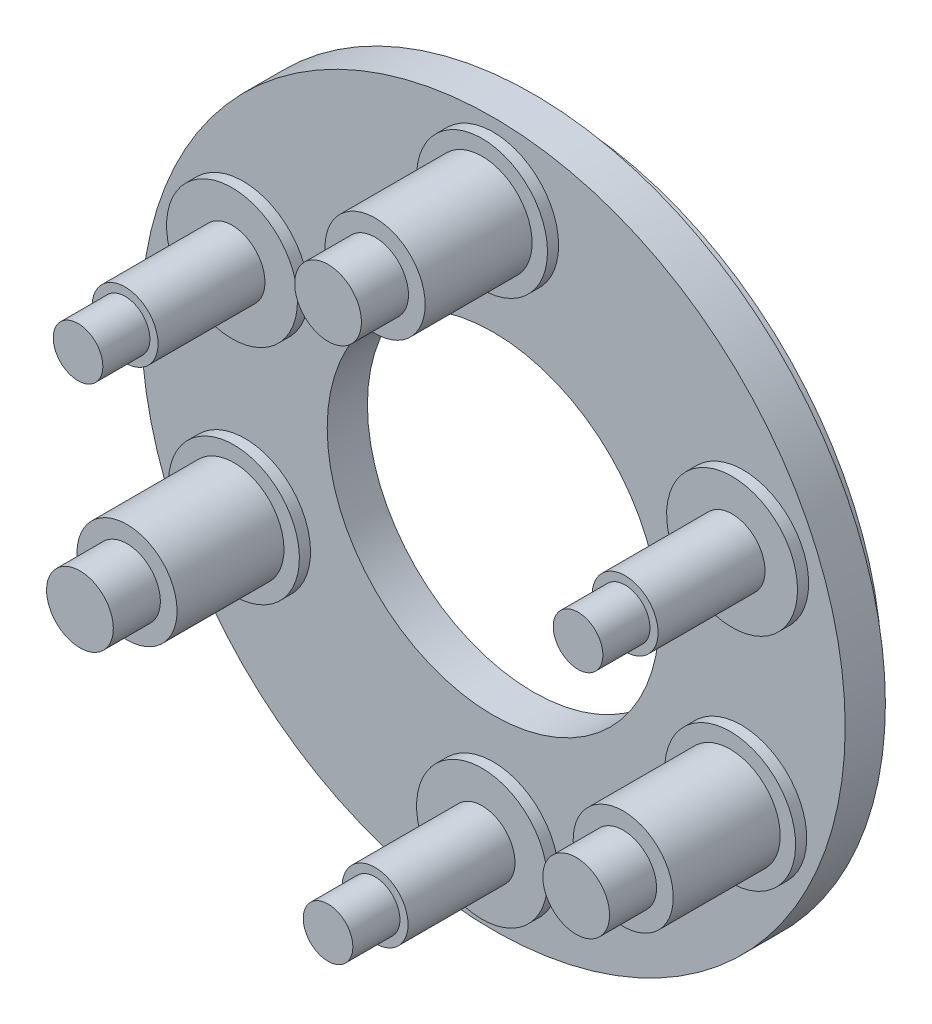
ISO-10303-21;
HEADER;
FILE_DESCRIPTION(('STEP AP214'),'2;1');
FILE_NAME('part.step','',(''),(''),'','','');
FILE_SCHEMA(('AUTOMOTIVE_DESIGN { 1 0 10303 214 1 1 1 1 }'));
ENDSEC;
DATA;
#1=APPLICATION_CONTEXT('core data for automotive mechanical design processes');
#2=APPLICATION_PROTOCOL_DEFINITION('international standard','automotive_design',2000,#1);
#3=PRODUCT_CONTEXT('',#1,'mechanical');
#4=PRODUCT('Part','Part','',(#3));
#5=PRODUCT_RELATED_PRODUCT_CATEGORY('part','',(#4));
#6=PRODUCT_DEFINITION_FORMATION('','',#4);
#7=PRODUCT_DEFINITION_CONTEXT('part definition',#1,'design');
#8=PRODUCT_DEFINITION('design','',#6,#7);
#9=PRODUCT_DEFINITION_SHAPE('','',#8);
#10=(LENGTH_UNIT() NAMED_UNIT(*) SI_UNIT(.MILLI.,.METRE.));
#11=(NAMED_UNIT(*) PLANE_ANGLE_UNIT() SI_UNIT($,.RADIAN.));
#12=(NAMED_UNIT(*) SI_UNIT($,.STERADIAN.) SOLID_ANGLE_UNIT());
#13=UNCERTAINTY_MEASURE_WITH_UNIT(LENGTH_MEASURE(1.E-05),#10,'distance_accuracy_value','');
#14=(GEOMETRIC_REPRESENTATION_CONTEXT(3) GLOBAL_UNCERTAINTY_ASSIGNED_CONTEXT((#13)) GLOBAL_UNIT_ASSIGNED_CONTEXT((#10,
#11,#12)) REPRESENTATION_CONTEXT('',''));
#15=CARTESIAN_POINT('',(0.,0.,0.));
#16=DIRECTION('',(0.,0.,1.));
#17=DIRECTION('',(1.,0.,0.));
#18=AXIS2_PLACEMENT_3D('',#15,#16,#17);
#19=CARTESIAN_POINT('',(0.,0.,0.));
#20=DIRECTION('',(0.,0.,1.));
#21=DIRECTION('',(1.,0.,0.));
#22=AXIS2_PLACEMENT_3D('',#19,#20,#21);
#23=PLANE('',#22);
#24=CARTESIAN_POINT('',(0.,0.,0.));
#25=DIRECTION('',(0.,0.,1.));
#26=DIRECTION('',(1.,0.,0.));
#27=AXIS2_PLACEMENT_3D('',#24,#25,#26);
#28=CIRCLE('',#27,4.9276);
#29=CARTESIAN_POINT('',(4.9276,0.,0.));
#30=VERTEX_POINT('',#29);
#31=EDGE_CURVE('E48',#30,#30,#28,.T.);
#32=ORIENTED_EDGE('',*,*,#31,.T.);
#33=EDGE_LOOP('',(#32));
#34=FACE_BOUND('',#33,.T.);
#35=CARTESIAN_POINT('',(0.,0.,0.));
#36=DIRECTION('',(0.,0.,-1.));
#37=DIRECTION('',(-1.,0.,0.));
#38=AXIS2_PLACEMENT_3D('',#35,#36,#37);
#39=CIRCLE('',#38,8.89);
#40=CARTESIAN_POINT('',(-8.89,0.,0.));
#41=VERTEX_POINT('',#40);
#42=EDGE_CURVE('E57',#41,#41,#39,.T.);
#43=ORIENTED_EDGE('',*,*,#42,.T.);
#44=EDGE_LOOP('',(#43));
#45=FACE_BOUND('',#44,.T.);
#46=ADVANCED_FACE('F30',(#34,#45),#23,.F.);
#47=CARTESIAN_POINT('',(0.,0.,1.1938));
#48=DIRECTION('',(0.,0.,1.));
#49=DIRECTION('',(1.,0.,0.));
#50=AXIS2_PLACEMENT_3D('',#47,#48,#49);
#51=PLANE('',#50);
#52=CARTESIAN_POINT('',(-7.42341139066719,3.15105118570178,1.1938));
#53=DIRECTION('',(0.,0.,1.));
#54=DIRECTION('',(-0.390731128489278,-0.920504853452439,0.));
#55=AXIS2_PLACEMENT_3D('',#52,#53,#54);
#56=CIRCLE('',#55,1.9431);
#57=CARTESIAN_POINT('',(-8.18264104643471,1.36241820495835,1.1938));
#58=VERTEX_POINT('',#57);
#59=EDGE_CURVE('E153',#58,#58,#56,.T.);
#60=ORIENTED_EDGE('',*,*,#59,.F.);
#61=EDGE_LOOP('',(#60));
#62=FACE_BOUND('',#61,.T.);
#63=CARTESIAN_POINT('',(7.42341139066719,3.15105118570178,1.1938));
#64=DIRECTION('',(0.,0.,1.));
#65=DIRECTION('',(-0.390731128489278,0.920504853452439,0.));
#66=AXIS2_PLACEMENT_3D('',#63,#64,#65);
#67=CIRCLE('',#66,1.9431);
#68=CARTESIAN_POINT('',(6.66418173489968,4.93968416644521,1.1938));
#69=VERTEX_POINT('',#68);
#70=EDGE_CURVE('E135',#69,#69,#67,.T.);
#71=ORIENTED_EDGE('',*,*,#70,.F.);
#72=EDGE_LOOP('',(#71));
#73=FACE_BOUND('',#72,.T.);
#74=CARTESIAN_POINT('',(0.,-8.0645,1.1938));
#75=DIRECTION('',(0.,0.,1.));
#76=DIRECTION('',(1.,0.,0.));
#77=AXIS2_PLACEMENT_3D('',#74,#75,#76);
#78=CIRCLE('',#77,1.9431);
#79=CARTESIAN_POINT('',(1.9431,-8.0645,1.1938));
#80=VERTEX_POINT('',#79);
#81=EDGE_CURVE('E117',#80,#80,#78,.T.);
#82=ORIENTED_EDGE('',*,*,#81,.F.);
#83=EDGE_LOOP('',(#82));
#84=FACE_BOUND('',#83,.T.);
#85=CARTESIAN_POINT('',(7.36646969303388,-3.43504123142844,1.1938));
#86=DIRECTION('',(0.,0.,1.));
#87=DIRECTION('',(-0.422618261740703,-0.906307787036648,0.));
#88=AXIS2_PLACEMENT_3D('',#85,#86,#87);
#89=CIRCLE('',#88,1.9431);
#90=CARTESIAN_POINT('',(6.54528014864552,-5.19608789241935,1.1938));
#91=VERTEX_POINT('',#90);
#92=EDGE_CURVE('E99',#91,#91,#89,.T.);
#93=ORIENTED_EDGE('',*,*,#92,.F.);
#94=EDGE_LOOP('',(#93));
#95=FACE_BOUND('',#94,.T.);
#96=CARTESIAN_POINT('',(-7.36646969303388,-3.43504123142844,1.1938));
#97=DIRECTION('',(0.,0.,1.));
#98=DIRECTION('',(-0.422618261740703,0.906307787036648,0.));
#99=AXIS2_PLACEMENT_3D('',#96,#97,#98);
#100=CIRCLE('',#99,1.9431);
#101=CARTESIAN_POINT('',(-8.18765923742224,-1.67399457043753,1.1938));
#102=VERTEX_POINT('',#101);
#103=EDGE_CURVE('E81',#102,#102,#100,.T.);
#104=ORIENTED_EDGE('',*,*,#103,.F.);
#105=EDGE_LOOP('',(#104));
#106=FACE_BOUND('',#105,.T.);
#107=CARTESIAN_POINT('',(0.,8.128,1.1938));
#108=DIRECTION('',(0.,0.,1.));
#109=DIRECTION('',(1.,0.,0.));
#110=AXIS2_PLACEMENT_3D('',#107,#108,#109);
#111=CIRCLE('',#110,1.9431);
#112=CARTESIAN_POINT('',(1.9431,8.128,1.1938));
#113=VERTEX_POINT('',#112);
#114=EDGE_CURVE('E63',#113,#113,#111,.T.);
#115=ORIENTED_EDGE('',*,*,#114,.F.);
#116=EDGE_LOOP('',(#115));
#117=FACE_BOUND('',#116,.T.);
#118=CARTESIAN_POINT('',(0.,0.,1.1938));
#119=DIRECTION('',(0.,0.,1.));
#120=DIRECTION('',(1.,0.,0.));
#121=AXIS2_PLACEMENT_3D('',#118,#119,#120);
#122=CIRCLE('',#121,10.4521);
#123=CARTESIAN_POINT('',(10.4521,0.,1.1938));
#124=VERTEX_POINT('',#123);
#125=EDGE_CURVE('E37',#124,#124,#122,.T.);
#126=ORIENTED_EDGE('',*,*,#125,.T.);
#127=EDGE_LOOP('',(#126));
#128=FACE_BOUND('',#127,.T.);
#129=CARTESIAN_POINT('',(0.,0.,1.1938));
#130=DIRECTION('',(0.,0.,1.));
#131=DIRECTION('',(1.,0.,0.));
#132=AXIS2_PLACEMENT_3D('',#129,#130,#131);
#133=CIRCLE('',#132,4.9276);
#134=CARTESIAN_POINT('',(4.9276,0.,1.1938));
#135=VERTEX_POINT('',#134);
#136=EDGE_CURVE('E46',#135,#135,#133,.T.);
#137=ORIENTED_EDGE('',*,*,#136,.F.);
#138=EDGE_LOOP('',(#137));
#139=FACE_BOUND('',#138,.T.);
#140=ADVANCED_FACE('F204',(#62,#73,#84,#95,#106,#117,#128,#139),#51,.T.);
#141=CARTESIAN_POINT('',(0.,0.,0.));
#142=DIRECTION('',(0.,0.,1.));
#143=DIRECTION('',(1.,0.,0.));
#144=AXIS2_PLACEMENT_3D('',#141,#142,#143);
#145=CIRCLE('',#144,9.6393);
#146=CARTESIAN_POINT('',(9.6393,0.,0.));
#147=VERTEX_POINT('',#146);
#148=EDGE_CURVE('E10',#147,#147,#145,.F.);
#149=ORIENTED_EDGE('',*,*,#148,.F.);
#150=EDGE_LOOP('',(#149));
#151=FACE_BOUND('',#150,.T.);
#152=CARTESIAN_POINT('',(0.,0.,0.));
#153=DIRECTION('',(0.,0.,1.));
#154=DIRECTION('',(1.,0.,0.));
#155=AXIS2_PLACEMENT_3D('',#152,#153,#154);
#156=CIRCLE('',#155,10.4521);
#157=CARTESIAN_POINT('',(10.4521,0.,0.));
#158=VERTEX_POINT('',#157);
#159=EDGE_CURVE('E41',#158,#158,#156,.T.);
#160=ORIENTED_EDGE('',*,*,#159,.F.);
#161=EDGE_LOOP('',(#160));
#162=FACE_BOUND('',#161,.T.);
#163=ADVANCED_FACE('F207',(#151,#162),#23,.F.);
#164=CARTESIAN_POINT('',(0.,0.,1.1938));
#165=DIRECTION('',(0.,0.,-1.));
#166=DIRECTION('',(-1.,0.,0.));
#167=AXIS2_PLACEMENT_3D('',#164,#165,#166);
#168=CYLINDRICAL_SURFACE('',#167,10.4521);
#169=ORIENTED_EDGE('',*,*,#125,.F.);
#170=EDGE_LOOP('',(#169));
#171=FACE_BOUND('',#170,.T.);
#172=ORIENTED_EDGE('',*,*,#159,.T.);
#173=EDGE_LOOP('',(#172));
#174=FACE_BOUND('',#173,.T.);
#175=ADVANCED_FACE('F32',(#171,#174),#168,.T.);
#176=CARTESIAN_POINT('',(0.,0.,1.1938));
#177=DIRECTION('',(0.,0.,-1.));
#178=DIRECTION('',(-1.,0.,0.));
#179=AXIS2_PLACEMENT_3D('',#176,#177,#178);
#180=CYLINDRICAL_SURFACE('',#179,4.9276);
#181=ORIENTED_EDGE('',*,*,#136,.T.);
#182=EDGE_LOOP('',(#181));
#183=FACE_BOUND('',#182,.T.);
#184=ORIENTED_EDGE('',*,*,#31,.F.);
#185=EDGE_LOOP('',(#184));
#186=FACE_BOUND('',#185,.T.);
#187=ADVANCED_FACE('F221',(#183,#186),#180,.F.);
#188=CARTESIAN_POINT('',(0.,0.,-0.7112));
#189=DIRECTION('',(0.,0.,-1.));
#190=DIRECTION('',(-1.,0.,0.));
#191=AXIS2_PLACEMENT_3D('',#188,#189,#190);
#192=PLANE('',#191);
#193=CARTESIAN_POINT('',(0.,0.,-0.7112));
#194=DIRECTION('',(0.,0.,-1.));
#195=DIRECTION('',(-1.,0.,0.));
#196=AXIS2_PLACEMENT_3D('',#193,#194,#195);
#197=CIRCLE('',#196,9.6393);
#198=CARTESIAN_POINT('',(-9.6393,0.,-0.7112));
#199=VERTEX_POINT('',#198);
#200=EDGE_CURVE('E51',#199,#199,#197,.T.);
#201=ORIENTED_EDGE('',*,*,#200,.T.);
#202=EDGE_LOOP('',(#201));
#203=FACE_BOUND('',#202,.T.);
#204=CARTESIAN_POINT('',(0.,0.,-0.7112));
#205=DIRECTION('',(0.,0.,-1.));
#206=DIRECTION('',(-1.,0.,0.));
#207=AXIS2_PLACEMENT_3D('',#204,#205,#206);
#208=CIRCLE('',#207,8.89);
#209=CARTESIAN_POINT('',(-8.89,0.,-0.7112));
#210=VERTEX_POINT('',#209);
#211=EDGE_CURVE('E56',#210,#210,#208,.T.);
#212=ORIENTED_EDGE('',*,*,#211,.F.);
#213=EDGE_LOOP('',(#212));
#214=FACE_BOUND('',#213,.T.);
#215=ADVANCED_FACE('F224',(#203,#214),#192,.T.);
#216=CARTESIAN_POINT('',(0.,0.,-0.7112));
#217=DIRECTION('',(0.,0.,1.));
#218=DIRECTION('',(1.,0.,0.));
#219=AXIS2_PLACEMENT_3D('',#216,#217,#218);
#220=CYLINDRICAL_SURFACE('',#219,9.6393);
#221=ORIENTED_EDGE('',*,*,#200,.F.);
#222=EDGE_LOOP('',(#221));
#223=FACE_BOUND('',#222,.T.);
#224=ORIENTED_EDGE('',*,*,#148,.T.);
#225=EDGE_LOOP('',(#224));
#226=FACE_BOUND('',#225,.T.);
#227=ADVANCED_FACE('F235',(#223,#226),#220,.T.);
#228=CARTESIAN_POINT('',(0.,0.,-0.7112));
#229=DIRECTION('',(0.,0.,1.));
#230=DIRECTION('',(1.,0.,0.));
#231=AXIS2_PLACEMENT_3D('',#228,#229,#230);
#232=CYLINDRICAL_SURFACE('',#231,8.89);
#233=ORIENTED_EDGE('',*,*,#211,.T.);
#234=EDGE_LOOP('',(#233));
#235=FACE_BOUND('',#234,.T.);
#236=ORIENTED_EDGE('',*,*,#42,.F.);
#237=EDGE_LOOP('',(#236));
#238=FACE_BOUND('',#237,.T.);
#239=ADVANCED_FACE('F232',(#235,#238),#232,.F.);
#240=CARTESIAN_POINT('',(0.,8.128,1.524));
#241=DIRECTION('',(0.,0.,-1.));
#242=DIRECTION('',(-1.,0.,0.));
#243=AXIS2_PLACEMENT_3D('',#240,#241,#242);
#244=CYLINDRICAL_SURFACE('',#243,1.9431);
#245=CARTESIAN_POINT('',(0.,8.128,1.524));
#246=DIRECTION('',(0.,0.,1.));
#247=DIRECTION('',(1.,0.,0.));
#248=AXIS2_PLACEMENT_3D('',#245,#246,#247);
#249=CIRCLE('',#248,1.9431);
#250=CARTESIAN_POINT('',(1.9431,8.128,1.524));
#251=VERTEX_POINT('',#250);
#252=EDGE_CURVE('E60',#251,#251,#249,.T.);
#253=ORIENTED_EDGE('',*,*,#252,.F.);
#254=EDGE_LOOP('',(#253));
#255=FACE_BOUND('',#254,.T.);
#256=ORIENTED_EDGE('',*,*,#114,.T.);
#257=EDGE_LOOP('',(#256));
#258=FACE_BOUND('',#257,.T.);
#259=ADVANCED_FACE('F234',(#255,#258),#244,.T.);
#260=CARTESIAN_POINT('',(0.,8.128,1.524));
#261=DIRECTION('',(0.,0.,1.));
#262=DIRECTION('',(1.,0.,0.));
#263=AXIS2_PLACEMENT_3D('',#260,#261,#262);
#264=PLANE('',#263);
#265=CARTESIAN_POINT('',(0.,8.128,1.524));
#266=DIRECTION('',(0.,0.,1.));
#267=DIRECTION('',(1.,0.,0.));
#268=AXIS2_PLACEMENT_3D('',#265,#266,#267);
#269=CIRCLE('',#268,1.4859);
#270=CARTESIAN_POINT('',(1.4859,8.128,1.524));
#271=VERTEX_POINT('',#270);
#272=EDGE_CURVE('E69',#271,#271,#269,.T.);
#273=ORIENTED_EDGE('',*,*,#272,.F.);
#274=EDGE_LOOP('',(#273));
#275=FACE_BOUND('',#274,.T.);
#276=ORIENTED_EDGE('',*,*,#252,.T.);
#277=EDGE_LOOP('',(#276));
#278=FACE_BOUND('',#277,.T.);
#279=ADVANCED_FACE('F242',(#275,#278),#264,.T.);
#280=CARTESIAN_POINT('',(0.,8.128,4.699));
#281=DIRECTION('',(0.,0.,-1.));
#282=DIRECTION('',(-1.,0.,0.));
#283=AXIS2_PLACEMENT_3D('',#280,#281,#282);
#284=CYLINDRICAL_SURFACE('',#283,1.4859);
#285=CARTESIAN_POINT('',(0.,8.128,4.699));
#286=DIRECTION('',(0.,0.,1.));
#287=DIRECTION('',(1.,0.,0.));
#288=AXIS2_PLACEMENT_3D('',#285,#286,#287);
#289=CIRCLE('',#288,1.4859);
#290=CARTESIAN_POINT('',(1.4859,8.128,4.699));
#291=VERTEX_POINT('',#290);
#292=EDGE_CURVE('E66',#291,#291,#289,.T.);
#293=ORIENTED_EDGE('',*,*,#292,.F.);
#294=EDGE_LOOP('',(#293));
#295=FACE_BOUND('',#294,.T.);
#296=ORIENTED_EDGE('',*,*,#272,.T.);
#297=EDGE_LOOP('',(#296));
#298=FACE_BOUND('',#297,.T.);
#299=ADVANCED_FACE('F294',(#295,#298),#284,.T.);
#300=CARTESIAN_POINT('',(0.,8.128,4.699));
#301=DIRECTION('',(0.,0.,1.));
#302=DIRECTION('',(1.,0.,0.));
#303=AXIS2_PLACEMENT_3D('',#300,#301,#302);
#304=PLANE('',#303);
#305=CARTESIAN_POINT('',(0.,8.128,4.699));
#306=DIRECTION('',(0.,0.,1.));
#307=DIRECTION('',(1.,0.,0.));
#308=AXIS2_PLACEMENT_3D('',#305,#306,#307);
#309=CIRCLE('',#308,0.9906);
#310=CARTESIAN_POINT('',(0.9906,8.128,4.699));
#311=VERTEX_POINT('',#310);
#312=EDGE_CURVE('E75',#311,#311,#309,.T.);
#313=ORIENTED_EDGE('',*,*,#312,.F.);
#314=EDGE_LOOP('',(#313));
#315=FACE_BOUND('',#314,.T.);
#316=ORIENTED_EDGE('',*,*,#292,.T.);
#317=EDGE_LOOP('',(#316));
#318=FACE_BOUND('',#317,.T.);
#319=ADVANCED_FACE('F303',(#315,#318),#304,.T.);
#320=CARTESIAN_POINT('',(0.,8.128,6.096));
#321=DIRECTION('',(0.,0.,-1.));
#322=DIRECTION('',(-1.,0.,0.));
#323=AXIS2_PLACEMENT_3D('',#320,#321,#322);
#324=CYLINDRICAL_SURFACE('',#323,0.9906);
#325=CARTESIAN_POINT('',(0.,8.128,6.096));
#326=DIRECTION('',(0.,0.,1.));
#327=DIRECTION('',(1.,0.,0.));
#328=AXIS2_PLACEMENT_3D('',#325,#326,#327);
#329=CIRCLE('',#328,0.9906);
#330=CARTESIAN_POINT('',(0.9906,8.128,6.096));
#331=VERTEX_POINT('',#330);
#332=EDGE_CURVE('E72',#331,#331,#329,.T.);
#333=ORIENTED_EDGE('',*,*,#332,.F.);
#334=EDGE_LOOP('',(#333));
#335=FACE_BOUND('',#334,.T.);
#336=ORIENTED_EDGE('',*,*,#312,.T.);
#337=EDGE_LOOP('',(#336));
#338=FACE_BOUND('',#337,.T.);
#339=ADVANCED_FACE('F313',(#335,#338),#324,.T.);
#340=CARTESIAN_POINT('',(0.,8.128,6.096));
#341=DIRECTION('',(0.,0.,1.));
#342=DIRECTION('',(1.,0.,0.));
#343=AXIS2_PLACEMENT_3D('',#340,#341,#342);
#344=PLANE('',#343);
#345=ORIENTED_EDGE('',*,*,#332,.T.);
#346=EDGE_LOOP('',(#345));
#347=FACE_BOUND('',#346,.T.);
#348=ADVANCED_FACE('F323',(#347),#344,.T.);
#349=CARTESIAN_POINT('',(-7.36646969303388,-3.43504123142844,1.524));
#350=DIRECTION('',(0.,0.,-1.));
#351=DIRECTION('',(-1.,0.,0.));
#352=AXIS2_PLACEMENT_3D('',#349,#350,#351);
#353=CYLINDRICAL_SURFACE('',#352,1.9431);
#354=CARTESIAN_POINT('',(-7.36646969303388,-3.43504123142844,1.524));
#355=DIRECTION('',(0.,0.,1.));
#356=DIRECTION('',(-0.422618261740703,0.906307787036648,0.));
#357=AXIS2_PLACEMENT_3D('',#354,#355,#356);
#358=CIRCLE('',#357,1.9431);
#359=CARTESIAN_POINT('',(-8.18765923742224,-1.67399457043753,1.524));
#360=VERTEX_POINT('',#359);
#361=EDGE_CURVE('E78',#360,#360,#358,.T.);
#362=ORIENTED_EDGE('',*,*,#361,.F.);
#363=EDGE_LOOP('',(#362));
#364=FACE_BOUND('',#363,.T.);
#365=ORIENTED_EDGE('',*,*,#103,.T.);
#366=EDGE_LOOP('',(#365));
#367=FACE_BOUND('',#366,.T.);
#368=ADVANCED_FACE('F333',(#364,#367),#353,.T.);
#369=CARTESIAN_POINT('',(-7.36646969303388,-3.43504123142844,1.524));
#370=DIRECTION('',(0.,0.,1.));
#371=DIRECTION('',(-0.422618261740703,0.906307787036648,0.));
#372=AXIS2_PLACEMENT_3D('',#369,#370,#371);
#373=PLANE('',#372);
#374=CARTESIAN_POINT('',(-7.36646969303388,-3.43504123142844,1.524));
#375=DIRECTION('',(0.,0.,1.));
#376=DIRECTION('',(-0.422618261740703,0.906307787036648,0.));
#377=AXIS2_PLACEMENT_3D('',#374,#375,#376);
#378=CIRCLE('',#377,1.4859);
#379=CARTESIAN_POINT('',(-7.99443816815439,-2.08835849067068,1.524));
#380=VERTEX_POINT('',#379);
#381=EDGE_CURVE('E87',#380,#380,#378,.T.);
#382=ORIENTED_EDGE('',*,*,#381,.F.);
#383=EDGE_LOOP('',(#382));
#384=FACE_BOUND('',#383,.T.);
#385=ORIENTED_EDGE('',*,*,#361,.T.);
#386=EDGE_LOOP('',(#385));
#387=FACE_BOUND('',#386,.T.);
#388=ADVANCED_FACE('F343',(#384,#387),#373,.T.);
#389=CARTESIAN_POINT('',(-7.36646969303388,-3.43504123142844,4.699));
#390=DIRECTION('',(0.,0.,-1.));
#391=DIRECTION('',(-1.,0.,0.));
#392=AXIS2_PLACEMENT_3D('',#389,#390,#391);
#393=CYLINDRICAL_SURFACE('',#392,1.4859);
#394=CARTESIAN_POINT('',(-7.36646969303388,-3.43504123142844,4.699));
#395=DIRECTION('',(0.,0.,1.));
#396=DIRECTION('',(-0.422618261740703,0.906307787036648,0.));
#397=AXIS2_PLACEMENT_3D('',#394,#395,#396);
#398=CIRCLE('',#397,1.4859);
#399=CARTESIAN_POINT('',(-7.99443816815439,-2.08835849067068,4.699));
#400=VERTEX_POINT('',#399);
#401=EDGE_CURVE('E84',#400,#400,#398,.T.);
#402=ORIENTED_EDGE('',*,*,#401,.F.);
#403=EDGE_LOOP('',(#402));
#404=FACE_BOUND('',#403,.T.);
#405=ORIENTED_EDGE('',*,*,#381,.T.);
#406=EDGE_LOOP('',(#405));
#407=FACE_BOUND('',#406,.T.);
#408=ADVANCED_FACE('F353',(#404,#407),#393,.T.);
#409=CARTESIAN_POINT('',(-7.36646969303388,-3.43504123142844,4.699));
#410=DIRECTION('',(0.,0.,1.));
#411=DIRECTION('',(-0.422618261740703,0.906307787036648,0.));
#412=AXIS2_PLACEMENT_3D('',#409,#410,#411);
#413=PLANE('',#412);
#414=CARTESIAN_POINT('',(-7.36646969303388,-3.43504123142844,4.699));
#415=DIRECTION('',(0.,0.,1.));
#416=DIRECTION('',(-0.422618261740703,0.906307787036648,0.));
#417=AXIS2_PLACEMENT_3D('',#414,#415,#416);
#418=CIRCLE('',#417,0.9906);
#419=CARTESIAN_POINT('',(-7.78511534311422,-2.53725273758993,4.699));
#420=VERTEX_POINT('',#419);
#421=EDGE_CURVE('E93',#420,#420,#418,.T.);
#422=ORIENTED_EDGE('',*,*,#421,.F.);
#423=EDGE_LOOP('',(#422));
#424=FACE_BOUND('',#423,.T.);
#425=ORIENTED_EDGE('',*,*,#401,.T.);
#426=EDGE_LOOP('',(#425));
#427=FACE_BOUND('',#426,.T.);
#428=ADVANCED_FACE('F363',(#424,#427),#413,.T.);
#429=CARTESIAN_POINT('',(-7.36646969303388,-3.43504123142844,6.096));
#430=DIRECTION('',(0.,0.,-1.));
#431=DIRECTION('',(-1.,0.,0.));
#432=AXIS2_PLACEMENT_3D('',#429,#430,#431);
#433=CYLINDRICAL_SURFACE('',#432,0.9906);
#434=CARTESIAN_POINT('',(-7.36646969303388,-3.43504123142844,6.096));
#435=DIRECTION('',(0.,0.,1.));
#436=DIRECTION('',(-0.422618261740703,0.906307787036648,0.));
#437=AXIS2_PLACEMENT_3D('',#434,#435,#436);
#438=CIRCLE('',#437,0.9906);
#439=CARTESIAN_POINT('',(-7.78511534311422,-2.53725273758993,6.096));
#440=VERTEX_POINT('',#439);
#441=EDGE_CURVE('E90',#440,#440,#438,.T.);
#442=ORIENTED_EDGE('',*,*,#441,.F.);
#443=EDGE_LOOP('',(#442));
#444=FACE_BOUND('',#443,.T.);
#445=ORIENTED_EDGE('',*,*,#421,.T.);
#446=EDGE_LOOP('',(#445));
#447=FACE_BOUND('',#446,.T.);
#448=ADVANCED_FACE('F373',(#444,#447),#433,.T.);
#449=CARTESIAN_POINT('',(-7.36646969303388,-3.43504123142844,6.096));
#450=DIRECTION('',(0.,0.,1.));
#451=DIRECTION('',(-0.422618261740703,0.906307787036648,0.));
#452=AXIS2_PLACEMENT_3D('',#449,#450,#451);
#453=PLANE('',#452);
#454=ORIENTED_EDGE('',*,*,#441,.T.);
#455=EDGE_LOOP('',(#454));
#456=FACE_BOUND('',#455,.T.);
#457=ADVANCED_FACE('F383',(#456),#453,.T.);
#458=CARTESIAN_POINT('',(7.36646969303388,-3.43504123142844,1.524));
#459=DIRECTION('',(0.,0.,-1.));
#460=DIRECTION('',(-1.,0.,0.));
#461=AXIS2_PLACEMENT_3D('',#458,#459,#460);
#462=CYLINDRICAL_SURFACE('',#461,1.9431);
#463=CARTESIAN_POINT('',(7.36646969303388,-3.43504123142844,1.524));
#464=DIRECTION('',(0.,0.,1.));
#465=DIRECTION('',(-0.422618261740703,-0.906307787036648,0.));
#466=AXIS2_PLACEMENT_3D('',#463,#464,#465);
#467=CIRCLE('',#466,1.9431);
#468=CARTESIAN_POINT('',(6.54528014864552,-5.19608789241935,1.524));
#469=VERTEX_POINT('',#468);
#470=EDGE_CURVE('E96',#469,#469,#467,.T.);
#471=ORIENTED_EDGE('',*,*,#470,.F.);
#472=EDGE_LOOP('',(#471));
#473=FACE_BOUND('',#472,.T.);
#474=ORIENTED_EDGE('',*,*,#92,.T.);
#475=EDGE_LOOP('',(#474));
#476=FACE_BOUND('',#475,.T.);
#477=ADVANCED_FACE('F393',(#473,#476),#462,.T.);
#478=CARTESIAN_POINT('',(7.36646969303388,-3.43504123142844,1.524));
#479=DIRECTION('',(0.,0.,1.));
#480=DIRECTION('',(-0.422618261740703,-0.906307787036648,0.));
#481=AXIS2_PLACEMENT_3D('',#478,#479,#480);
#482=PLANE('',#481);
#483=CARTESIAN_POINT('',(7.36646969303388,-3.43504123142844,1.524));
#484=DIRECTION('',(0.,0.,1.));
#485=DIRECTION('',(-0.422618261740703,-0.906307787036648,0.));
#486=AXIS2_PLACEMENT_3D('',#483,#484,#485);
#487=CIRCLE('',#486,1.4859);
#488=CARTESIAN_POINT('',(6.73850121791336,-4.78172397218619,1.524));
#489=VERTEX_POINT('',#488);
#490=EDGE_CURVE('E105',#489,#489,#487,.T.);
#491=ORIENTED_EDGE('',*,*,#490,.F.);
#492=EDGE_LOOP('',(#491));
#493=FACE_BOUND('',#492,.T.);
#494=ORIENTED_EDGE('',*,*,#470,.T.);
#495=EDGE_LOOP('',(#494));
#496=FACE_BOUND('',#495,.T.);
#497=ADVANCED_FACE('F403',(#493,#496),#482,.T.);
#498=CARTESIAN_POINT('',(7.36646969303388,-3.43504123142844,4.699));
#499=DIRECTION('',(0.,0.,-1.));
#500=DIRECTION('',(-1.,0.,0.));
#501=AXIS2_PLACEMENT_3D('',#498,#499,#500);
#502=CYLINDRICAL_SURFACE('',#501,1.4859);
#503=CARTESIAN_POINT('',(7.36646969303388,-3.43504123142844,4.699));
#504=DIRECTION('',(0.,0.,1.));
#505=DIRECTION('',(-0.422618261740703,-0.906307787036648,0.));
#506=AXIS2_PLACEMENT_3D('',#503,#504,#505);
#507=CIRCLE('',#506,1.4859);
#508=CARTESIAN_POINT('',(6.73850121791336,-4.78172397218619,4.699));
#509=VERTEX_POINT('',#508);
#510=EDGE_CURVE('E102',#509,#509,#507,.T.);
#511=ORIENTED_EDGE('',*,*,#510,.F.);
#512=EDGE_LOOP('',(#511));
#513=FACE_BOUND('',#512,.T.);
#514=ORIENTED_EDGE('',*,*,#490,.T.);
#515=EDGE_LOOP('',(#514));
#516=FACE_BOUND('',#515,.T.);
#517=ADVANCED_FACE('F413',(#513,#516),#502,.T.);
#518=CARTESIAN_POINT('',(7.36646969303388,-3.43504123142844,4.699));
#519=DIRECTION('',(0.,0.,1.));
#520=DIRECTION('',(-0.422618261740703,-0.906307787036648,0.));
#521=AXIS2_PLACEMENT_3D('',#518,#519,#520);
#522=PLANE('',#521);
#523=CARTESIAN_POINT('',(7.36646969303388,-3.43504123142844,4.699));
#524=DIRECTION('',(0.,0.,1.));
#525=DIRECTION('',(-0.422618261740703,-0.906307787036648,0.));
#526=AXIS2_PLACEMENT_3D('',#523,#524,#525);
#527=CIRCLE('',#526,0.9906);
#528=CARTESIAN_POINT('',(6.94782404295354,-4.33282972526694,4.699));
#529=VERTEX_POINT('',#528);
#530=EDGE_CURVE('E111',#529,#529,#527,.T.);
#531=ORIENTED_EDGE('',*,*,#530,.F.);
#532=EDGE_LOOP('',(#531));
#533=FACE_BOUND('',#532,.T.);
#534=ORIENTED_EDGE('',*,*,#510,.T.);
#535=EDGE_LOOP('',(#534));
#536=FACE_BOUND('',#535,.T.);
#537=ADVANCED_FACE('F423',(#533,#536),#522,.T.);
#538=CARTESIAN_POINT('',(7.36646969303388,-3.43504123142844,6.096));
#539=DIRECTION('',(0.,0.,-1.));
#540=DIRECTION('',(-1.,0.,0.));
#541=AXIS2_PLACEMENT_3D('',#538,#539,#540);
#542=CYLINDRICAL_SURFACE('',#541,0.9906);
#543=CARTESIAN_POINT('',(7.36646969303388,-3.43504123142844,6.096));
#544=DIRECTION('',(0.,0.,1.));
#545=DIRECTION('',(-0.422618261740703,-0.906307787036648,0.));
#546=AXIS2_PLACEMENT_3D('',#543,#544,#545);
#547=CIRCLE('',#546,0.9906);
#548=CARTESIAN_POINT('',(6.94782404295354,-4.33282972526694,6.096));
#549=VERTEX_POINT('',#548);
#550=EDGE_CURVE('E108',#549,#549,#547,.T.);
#551=ORIENTED_EDGE('',*,*,#550,.F.);
#552=EDGE_LOOP('',(#551));
#553=FACE_BOUND('',#552,.T.);
#554=ORIENTED_EDGE('',*,*,#530,.T.);
#555=EDGE_LOOP('',(#554));
#556=FACE_BOUND('',#555,.T.);
#557=ADVANCED_FACE('F433',(#553,#556),#542,.T.);
#558=CARTESIAN_POINT('',(7.36646969303388,-3.43504123142844,6.096));
#559=DIRECTION('',(0.,0.,1.));
#560=DIRECTION('',(-0.422618261740703,-0.906307787036648,0.));
#561=AXIS2_PLACEMENT_3D('',#558,#559,#560);
#562=PLANE('',#561);
#563=ORIENTED_EDGE('',*,*,#550,.T.);
#564=EDGE_LOOP('',(#563));
#565=FACE_BOUND('',#564,.T.);
#566=ADVANCED_FACE('F443',(#565),#562,.T.);
#567=CARTESIAN_POINT('',(0.,-8.0645,1.524));
#568=DIRECTION('',(0.,0.,-1.));
#569=DIRECTION('',(-1.,0.,0.));
#570=AXIS2_PLACEMENT_3D('',#567,#568,#569);
#571=CYLINDRICAL_SURFACE('',#570,1.9431);
#572=CARTESIAN_POINT('',(0.,-8.0645,1.524));
#573=DIRECTION('',(0.,0.,1.));
#574=DIRECTION('',(1.,0.,0.));
#575=AXIS2_PLACEMENT_3D('',#572,#573,#574);
#576=CIRCLE('',#575,1.9431);
#577=CARTESIAN_POINT('',(1.9431,-8.0645,1.524));
#578=VERTEX_POINT('',#577);
#579=EDGE_CURVE('E114',#578,#578,#576,.T.);
#580=ORIENTED_EDGE('',*,*,#579,.F.);
#581=EDGE_LOOP('',(#580));
#582=FACE_BOUND('',#581,.T.);
#583=ORIENTED_EDGE('',*,*,#81,.T.);
#584=EDGE_LOOP('',(#583));
#585=FACE_BOUND('',#584,.T.);
#586=ADVANCED_FACE('F453',(#582,#585),#571,.T.);
#587=CARTESIAN_POINT('',(0.,-8.0645,1.524));
#588=DIRECTION('',(0.,0.,1.));
#589=DIRECTION('',(1.,0.,0.));
#590=AXIS2_PLACEMENT_3D('',#587,#588,#589);
#591=PLANE('',#590);
#592=CARTESIAN_POINT('',(0.,-8.0645,1.524));
#593=DIRECTION('',(0.,0.,1.));
#594=DIRECTION('',(1.,0.,0.));
#595=AXIS2_PLACEMENT_3D('',#592,#593,#594);
#596=CIRCLE('',#595,0.9779);
#597=CARTESIAN_POINT('',(0.977900000000001,-8.0645,1.524));
#598=VERTEX_POINT('',#597);
#599=EDGE_CURVE('E123',#598,#598,#596,.T.);
#600=ORIENTED_EDGE('',*,*,#599,.F.);
#601=EDGE_LOOP('',(#600));
#602=FACE_BOUND('',#601,.T.);
#603=ORIENTED_EDGE('',*,*,#579,.T.);
#604=EDGE_LOOP('',(#603));
#605=FACE_BOUND('',#604,.T.);
#606=ADVANCED_FACE('F463',(#602,#605),#591,.T.);
#607=CARTESIAN_POINT('',(0.,-8.0645,4.699));
#608=DIRECTION('',(0.,0.,-1.));
#609=DIRECTION('',(-1.,0.,0.));
#610=AXIS2_PLACEMENT_3D('',#607,#608,#609);
#611=CYLINDRICAL_SURFACE('',#610,0.9779);
#612=CARTESIAN_POINT('',(0.,-8.0645,4.699));
#613=DIRECTION('',(0.,0.,1.));
#614=DIRECTION('',(1.,0.,0.));
#615=AXIS2_PLACEMENT_3D('',#612,#613,#614);
#616=CIRCLE('',#615,0.9779);
#617=CARTESIAN_POINT('',(0.977900000000001,-8.0645,4.699));
#618=VERTEX_POINT('',#617);
#619=EDGE_CURVE('E120',#618,#618,#616,.T.);
#620=ORIENTED_EDGE('',*,*,#619,.F.);
#621=EDGE_LOOP('',(#620));
#622=FACE_BOUND('',#621,.T.);
#623=ORIENTED_EDGE('',*,*,#599,.T.);
#624=EDGE_LOOP('',(#623));
#625=FACE_BOUND('',#624,.T.);
#626=ADVANCED_FACE('F473',(#622,#625),#611,.T.);
#627=CARTESIAN_POINT('',(0.,-8.0645,4.699));
#628=DIRECTION('',(0.,0.,1.));
#629=DIRECTION('',(1.,0.,0.));
#630=AXIS2_PLACEMENT_3D('',#627,#628,#629);
#631=PLANE('',#630);
#632=CARTESIAN_POINT('',(0.,-8.0645,4.699));
#633=DIRECTION('',(0.,0.,1.));
#634=DIRECTION('',(1.,0.,0.));
#635=AXIS2_PLACEMENT_3D('',#632,#633,#634);
#636=CIRCLE('',#635,0.736600000000001);
#637=CARTESIAN_POINT('',(0.736600000000002,-8.0645,4.699));
#638=VERTEX_POINT('',#637);
#639=EDGE_CURVE('E129',#638,#638,#636,.T.);
#640=ORIENTED_EDGE('',*,*,#639,.F.);
#641=EDGE_LOOP('',(#640));
#642=FACE_BOUND('',#641,.T.);
#643=ORIENTED_EDGE('',*,*,#619,.T.);
#644=EDGE_LOOP('',(#643));
#645=FACE_BOUND('',#644,.T.);
#646=ADVANCED_FACE('F483',(#642,#645),#631,.T.);
#647=CARTESIAN_POINT('',(0.,-8.0645,6.096));
#648=DIRECTION('',(0.,0.,-1.));
#649=DIRECTION('',(-1.,0.,0.));
#650=AXIS2_PLACEMENT_3D('',#647,#648,#649);
#651=CYLINDRICAL_SURFACE('',#650,0.736600000000001);
#652=CARTESIAN_POINT('',(0.,-8.0645,6.096));
#653=DIRECTION('',(0.,0.,1.));
#654=DIRECTION('',(1.,0.,0.));
#655=AXIS2_PLACEMENT_3D('',#652,#653,#654);
#656=CIRCLE('',#655,0.736600000000001);
#657=CARTESIAN_POINT('',(0.736600000000002,-8.0645,6.096));
#658=VERTEX_POINT('',#657);
#659=EDGE_CURVE('E126',#658,#658,#656,.T.);
#660=ORIENTED_EDGE('',*,*,#659,.F.);
#661=EDGE_LOOP('',(#660));
#662=FACE_BOUND('',#661,.T.);
#663=ORIENTED_EDGE('',*,*,#639,.T.);
#664=EDGE_LOOP('',(#663));
#665=FACE_BOUND('',#664,.T.);
#666=ADVANCED_FACE('F493',(#662,#665),#651,.T.);
#667=CARTESIAN_POINT('',(0.,-8.0645,6.096));
#668=DIRECTION('',(0.,0.,1.));
#669=DIRECTION('',(1.,0.,0.));
#670=AXIS2_PLACEMENT_3D('',#667,#668,#669);
#671=PLANE('',#670);
#672=ORIENTED_EDGE('',*,*,#659,.T.);
#673=EDGE_LOOP('',(#672));
#674=FACE_BOUND('',#673,.T.);
#675=ADVANCED_FACE('F503',(#674),#671,.T.);
#676=CARTESIAN_POINT('',(7.42341139066719,3.15105118570178,1.524));
#677=DIRECTION('',(0.,0.,-1.));
#678=DIRECTION('',(-1.,0.,0.));
#679=AXIS2_PLACEMENT_3D('',#676,#677,#678);
#680=CYLINDRICAL_SURFACE('',#679,1.9431);
#681=CARTESIAN_POINT('',(7.42341139066719,3.15105118570178,1.524));
#682=DIRECTION('',(0.,0.,1.));
#683=DIRECTION('',(-0.390731128489278,0.920504853452439,0.));
#684=AXIS2_PLACEMENT_3D('',#681,#682,#683);
#685=CIRCLE('',#684,1.9431);
#686=CARTESIAN_POINT('',(6.66418173489968,4.93968416644521,1.524));
#687=VERTEX_POINT('',#686);
#688=EDGE_CURVE('E132',#687,#687,#685,.T.);
#689=ORIENTED_EDGE('',*,*,#688,.F.);
#690=EDGE_LOOP('',(#689));
#691=FACE_BOUND('',#690,.T.);
#692=ORIENTED_EDGE('',*,*,#70,.T.);
#693=EDGE_LOOP('',(#692));
#694=FACE_BOUND('',#693,.T.);
#695=ADVANCED_FACE('F513',(#691,#694),#680,.T.);
#696=CARTESIAN_POINT('',(7.42341139066719,3.15105118570178,1.524));
#697=DIRECTION('',(0.,0.,1.));
#698=DIRECTION('',(-0.390731128489278,0.920504853452439,0.));
#699=AXIS2_PLACEMENT_3D('',#696,#697,#698);
#700=PLANE('',#699);
#701=CARTESIAN_POINT('',(7.42341139066719,3.15105118570178,1.524));
#702=DIRECTION('',(0.,0.,1.));
#703=DIRECTION('',(-0.390731128489278,0.920504853452439,0.));
#704=AXIS2_PLACEMENT_3D('',#701,#702,#703);
#705=CIRCLE('',#704,0.9779);
#706=CARTESIAN_POINT('',(7.04131542011753,4.05121288189292,1.524));
#707=VERTEX_POINT('',#706);
#708=EDGE_CURVE('E141',#707,#707,#705,.T.);
#709=ORIENTED_EDGE('',*,*,#708,.F.);
#710=EDGE_LOOP('',(#709));
#711=FACE_BOUND('',#710,.T.);
#712=ORIENTED_EDGE('',*,*,#688,.T.);
#713=EDGE_LOOP('',(#712));
#714=FACE_BOUND('',#713,.T.);
#715=ADVANCED_FACE('F523',(#711,#714),#700,.T.);
#716=CARTESIAN_POINT('',(7.42341139066719,3.15105118570178,4.699));
#717=DIRECTION('',(0.,0.,-1.));
#718=DIRECTION('',(-1.,0.,0.));
#719=AXIS2_PLACEMENT_3D('',#716,#717,#718);
#720=CYLINDRICAL_SURFACE('',#719,0.9779);
#721=CARTESIAN_POINT('',(7.42341139066719,3.15105118570178,4.699));
#722=DIRECTION('',(0.,0.,1.));
#723=DIRECTION('',(-0.390731128489278,0.920504853452439,0.));
#724=AXIS2_PLACEMENT_3D('',#721,#722,#723);
#725=CIRCLE('',#724,0.9779);
#726=CARTESIAN_POINT('',(7.04131542011753,4.05121288189292,4.699));
#727=VERTEX_POINT('',#726);
#728=EDGE_CURVE('E138',#727,#727,#725,.T.);
#729=ORIENTED_EDGE('',*,*,#728,.F.);
#730=EDGE_LOOP('',(#729));
#731=FACE_BOUND('',#730,.T.);
#732=ORIENTED_EDGE('',*,*,#708,.T.);
#733=EDGE_LOOP('',(#732));
#734=FACE_BOUND('',#733,.T.);
#735=ADVANCED_FACE('F533',(#731,#734),#720,.T.);
#736=CARTESIAN_POINT('',(7.42341139066719,3.15105118570178,4.699));
#737=DIRECTION('',(0.,0.,1.));
#738=DIRECTION('',(-0.390731128489278,0.920504853452439,0.));
#739=AXIS2_PLACEMENT_3D('',#736,#737,#738);
#740=PLANE('',#739);
#741=CARTESIAN_POINT('',(7.42341139066719,3.15105118570178,4.699));
#742=DIRECTION('',(0.,0.,1.));
#743=DIRECTION('',(-0.390731128489278,0.920504853452439,0.));
#744=AXIS2_PLACEMENT_3D('',#741,#742,#743);
#745=CIRCLE('',#744,0.736600000000001);
#746=CARTESIAN_POINT('',(7.13559884142199,3.82909506075485,4.699));
#747=VERTEX_POINT('',#746);
#748=EDGE_CURVE('E147',#747,#747,#745,.T.);
#749=ORIENTED_EDGE('',*,*,#748,.F.);
#750=EDGE_LOOP('',(#749));
#751=FACE_BOUND('',#750,.T.);
#752=ORIENTED_EDGE('',*,*,#728,.T.);
#753=EDGE_LOOP('',(#752));
#754=FACE_BOUND('',#753,.T.);
#755=ADVANCED_FACE('F543',(#751,#754),#740,.T.);
#756=CARTESIAN_POINT('',(7.42341139066719,3.15105118570178,6.096));
#757=DIRECTION('',(0.,0.,-1.));
#758=DIRECTION('',(-1.,0.,0.));
#759=AXIS2_PLACEMENT_3D('',#756,#757,#758);
#760=CYLINDRICAL_SURFACE('',#759,0.736600000000001);
#761=CARTESIAN_POINT('',(7.42341139066719,3.15105118570178,6.096));
#762=DIRECTION('',(0.,0.,1.));
#763=DIRECTION('',(-0.390731128489278,0.920504853452439,0.));
#764=AXIS2_PLACEMENT_3D('',#761,#762,#763);
#765=CIRCLE('',#764,0.736600000000001);
#766=CARTESIAN_POINT('',(7.13559884142199,3.82909506075485,6.096));
#767=VERTEX_POINT('',#766);
#768=EDGE_CURVE('E144',#767,#767,#765,.T.);
#769=ORIENTED_EDGE('',*,*,#768,.F.);
#770=EDGE_LOOP('',(#769));
#771=FACE_BOUND('',#770,.T.);
#772=ORIENTED_EDGE('',*,*,#748,.T.);
#773=EDGE_LOOP('',(#772));
#774=FACE_BOUND('',#773,.T.);
#775=ADVANCED_FACE('F553',(#771,#774),#760,.T.);
#776=CARTESIAN_POINT('',(7.42341139066719,3.15105118570178,6.096));
#777=DIRECTION('',(0.,0.,1.));
#778=DIRECTION('',(-0.390731128489278,0.920504853452439,0.));
#779=AXIS2_PLACEMENT_3D('',#776,#777,#778);
#780=PLANE('',#779);
#781=ORIENTED_EDGE('',*,*,#768,.T.);
#782=EDGE_LOOP('',(#781));
#783=FACE_BOUND('',#782,.T.);
#784=ADVANCED_FACE('F200',(#783),#780,.T.);
#785=CARTESIAN_POINT('',(-7.42341139066719,3.15105118570178,1.524));
#786=DIRECTION('',(0.,0.,-1.));
#787=DIRECTION('',(-1.,0.,0.));
#788=AXIS2_PLACEMENT_3D('',#785,#786,#787);
#789=CYLINDRICAL_SURFACE('',#788,1.9431);
#790=CARTESIAN_POINT('',(-7.42341139066719,3.15105118570178,1.524));
#791=DIRECTION('',(0.,0.,1.));
#792=DIRECTION('',(-0.390731128489278,-0.920504853452439,0.));
#793=AXIS2_PLACEMENT_3D('',#790,#791,#792);
#794=CIRCLE('',#793,1.9431);
#795=CARTESIAN_POINT('',(-8.18264104643471,1.36241820495835,1.524));
#796=VERTEX_POINT('',#795);
#797=EDGE_CURVE('E150',#796,#796,#794,.T.);
#798=ORIENTED_EDGE('',*,*,#797,.F.);
#799=EDGE_LOOP('',(#798));
#800=FACE_BOUND('',#799,.T.);
#801=ORIENTED_EDGE('',*,*,#59,.T.);
#802=EDGE_LOOP('',(#801));
#803=FACE_BOUND('',#802,.T.);
#804=ADVANCED_FACE('F194',(#800,#803),#789,.T.);
#805=CARTESIAN_POINT('',(-7.42341139066719,3.15105118570178,1.524));
#806=DIRECTION('',(0.,0.,1.));
#807=DIRECTION('',(-0.390731128489278,-0.920504853452439,0.));
#808=AXIS2_PLACEMENT_3D('',#805,#806,#807);
#809=PLANE('',#808);
#810=CARTESIAN_POINT('',(-7.42341139066719,3.15105118570178,1.524));
#811=DIRECTION('',(0.,0.,1.));
#812=DIRECTION('',(-0.390731128489278,-0.920504853452439,0.));
#813=AXIS2_PLACEMENT_3D('',#810,#811,#812);
#814=CIRCLE('',#813,0.9779);
#815=CARTESIAN_POINT('',(-7.80550736121686,2.25088948951064,1.524));
#816=VERTEX_POINT('',#815);
#817=EDGE_CURVE('E159',#816,#816,#814,.T.);
#818=ORIENTED_EDGE('',*,*,#817,.F.);
#819=EDGE_LOOP('',(#818));
#820=FACE_BOUND('',#819,.T.);
#821=ORIENTED_EDGE('',*,*,#797,.T.);
#822=EDGE_LOOP('',(#821));
#823=FACE_BOUND('',#822,.T.);
#824=ADVANCED_FACE('F188',(#820,#823),#809,.T.);
#825=CARTESIAN_POINT('',(-7.42341139066719,3.15105118570178,4.699));
#826=DIRECTION('',(0.,0.,-1.));
#827=DIRECTION('',(-1.,0.,0.));
#828=AXIS2_PLACEMENT_3D('',#825,#826,#827);
#829=CYLINDRICAL_SURFACE('',#828,0.9779);
#830=CARTESIAN_POINT('',(-7.42341139066719,3.15105118570178,4.699));
#831=DIRECTION('',(0.,0.,1.));
#832=DIRECTION('',(-0.390731128489278,-0.920504853452439,0.));
#833=AXIS2_PLACEMENT_3D('',#830,#831,#832);
#834=CIRCLE('',#833,0.9779);
#835=CARTESIAN_POINT('',(-7.80550736121686,2.25088948951064,4.699));
#836=VERTEX_POINT('',#835);
#837=EDGE_CURVE('E156',#836,#836,#834,.T.);
#838=ORIENTED_EDGE('',*,*,#837,.F.);
#839=EDGE_LOOP('',(#838));
#840=FACE_BOUND('',#839,.T.);
#841=ORIENTED_EDGE('',*,*,#817,.T.);
#842=EDGE_LOOP('',(#841));
#843=FACE_BOUND('',#842,.T.);
#844=ADVANCED_FACE('F182',(#840,#843),#829,.T.);
#845=CARTESIAN_POINT('',(-7.42341139066719,3.15105118570178,4.699));
#846=DIRECTION('',(0.,0.,1.));
#847=DIRECTION('',(-0.390731128489278,-0.920504853452439,0.));
#848=AXIS2_PLACEMENT_3D('',#845,#846,#847);
#849=PLANE('',#848);
#850=CARTESIAN_POINT('',(-7.42341139066719,3.15105118570178,4.699));
#851=DIRECTION('',(0.,0.,1.));
#852=DIRECTION('',(-0.390731128489278,-0.920504853452439,0.));
#853=AXIS2_PLACEMENT_3D('',#850,#851,#852);
#854=CIRCLE('',#853,0.736600000000001);
#855=CARTESIAN_POINT('',(-7.7112239399124,2.47300731064871,4.699));
#856=VERTEX_POINT('',#855);
#857=EDGE_CURVE('E165',#856,#856,#854,.T.);
#858=ORIENTED_EDGE('',*,*,#857,.F.);
#859=EDGE_LOOP('',(#858));
#860=FACE_BOUND('',#859,.T.);
#861=ORIENTED_EDGE('',*,*,#837,.T.);
#862=EDGE_LOOP('',(#861));
#863=FACE_BOUND('',#862,.T.);
#864=ADVANCED_FACE('F176',(#860,#863),#849,.T.);
#865=CARTESIAN_POINT('',(-7.42341139066719,3.15105118570178,6.096));
#866=DIRECTION('',(0.,0.,-1.));
#867=DIRECTION('',(-1.,0.,0.));
#868=AXIS2_PLACEMENT_3D('',#865,#866,#867);
#869=CYLINDRICAL_SURFACE('',#868,0.736600000000001);
#870=CARTESIAN_POINT('',(-7.42341139066719,3.15105118570178,6.096));
#871=DIRECTION('',(0.,0.,1.));
#872=DIRECTION('',(-0.390731128489278,-0.920504853452439,0.));
#873=AXIS2_PLACEMENT_3D('',#870,#871,#872);
#874=CIRCLE('',#873,0.736600000000001);
#875=CARTESIAN_POINT('',(-7.7112239399124,2.47300731064871,6.096));
#876=VERTEX_POINT('',#875);
#877=EDGE_CURVE('E162',#876,#876,#874,.T.);
#878=ORIENTED_EDGE('',*,*,#877,.F.);
#879=EDGE_LOOP('',(#878));
#880=FACE_BOUND('',#879,.T.);
#881=ORIENTED_EDGE('',*,*,#857,.T.);
#882=EDGE_LOOP('',(#881));
#883=FACE_BOUND('',#882,.T.);
#884=ADVANCED_FACE('F173',(#880,#883),#869,.T.);
#885=CARTESIAN_POINT('',(-7.42341139066719,3.15105118570178,6.096));
#886=DIRECTION('',(0.,0.,1.));
#887=DIRECTION('',(-0.390731128489278,-0.920504853452439,0.));
#888=AXIS2_PLACEMENT_3D('',#885,#886,#887);
#889=PLANE('',#888);
#890=ORIENTED_EDGE('',*,*,#877,.T.);
#891=EDGE_LOOP('',(#890));
#892=FACE_BOUND('',#891,.T.);
#893=ADVANCED_FACE('F171',(#892),#889,.T.);
#894=CLOSED_SHELL('',(#46,#140,#163,#175,#187,#215,#227,#239,#259,#279,#299,#319,#339,#348,#368,
#388,#408,#428,#448,#457,#477,#497,#517,#537,#557,#566,#586,#606,#626,#646,#666,#675,#695,#715,
#735,#755,#775,#784,#804,#824,#844,#864,#884,#893));
#895=MANIFOLD_SOLID_BREP('B2',#894);
#896=ADVANCED_BREP_SHAPE_REPRESENTATION('',(#18,#895),#14);
#897=SHAPE_DEFINITION_REPRESENTATION(#9,#896);
ENDSEC;
END-ISO-10303-21;
